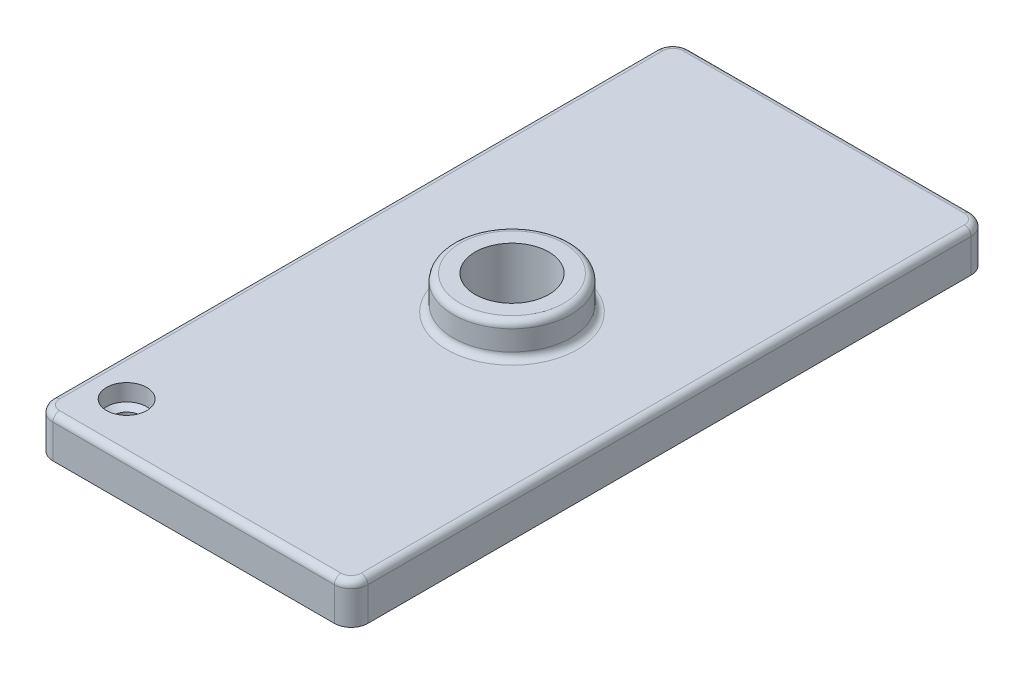
ISO-10303-21;
HEADER;
FILE_DESCRIPTION(('STEP AP214'),'2;1');
FILE_NAME('part.step','',(''),(''),'','','');
FILE_SCHEMA(('AUTOMOTIVE_DESIGN { 1 0 10303 214 1 1 1 1 }'));
ENDSEC;
DATA;
#1=APPLICATION_CONTEXT('core data for automotive mechanical design processes');
#2=APPLICATION_PROTOCOL_DEFINITION('international standard','automotive_design',2000,#1);
#3=PRODUCT_CONTEXT('',#1,'mechanical');
#4=PRODUCT('Part','Part','',(#3));
#5=PRODUCT_RELATED_PRODUCT_CATEGORY('part','',(#4));
#6=PRODUCT_DEFINITION_FORMATION('','',#4);
#7=PRODUCT_DEFINITION_CONTEXT('part definition',#1,'design');
#8=PRODUCT_DEFINITION('design','',#6,#7);
#9=PRODUCT_DEFINITION_SHAPE('','',#8);
#10=(LENGTH_UNIT() NAMED_UNIT(*) SI_UNIT(.MILLI.,.METRE.));
#11=(NAMED_UNIT(*) PLANE_ANGLE_UNIT() SI_UNIT($,.RADIAN.));
#12=(NAMED_UNIT(*) SI_UNIT($,.STERADIAN.) SOLID_ANGLE_UNIT());
#13=UNCERTAINTY_MEASURE_WITH_UNIT(LENGTH_MEASURE(1.E-05),#10,'distance_accuracy_value','');
#14=(GEOMETRIC_REPRESENTATION_CONTEXT(3) GLOBAL_UNCERTAINTY_ASSIGNED_CONTEXT((#13)) GLOBAL_UNIT_ASSIGNED_CONTEXT((#10,
#11,#12)) REPRESENTATION_CONTEXT('',''));
#15=CARTESIAN_POINT('',(0.,0.,0.));
#16=DIRECTION('',(0.,0.,1.));
#17=DIRECTION('',(1.,0.,0.));
#18=AXIS2_PLACEMENT_3D('',#15,#16,#17);
#19=CARTESIAN_POINT('',(-47.,12.,-95.));
#20=DIRECTION('',(0.,-1.,0.));
#21=DIRECTION('',(0.,0.,-1.));
#22=AXIS2_PLACEMENT_3D('',#19,#20,#21);
#23=PLANE('',#22);
#24=CARTESIAN_POINT('',(42.,12.,90.));
#25=DIRECTION('',(0.,-1.,0.));
#26=DIRECTION('',(0.,0.,-1.));
#27=AXIS2_PLACEMENT_3D('',#24,#25,#26);
#28=CIRCLE('',#27,3.);
#29=CARTESIAN_POINT('',(42.,12.,93.));
#30=VERTEX_POINT('',#29);
#31=CARTESIAN_POINT('',(45.,12.,90.));
#32=VERTEX_POINT('',#31);
#33=EDGE_CURVE('E193',#30,#32,#28,.F.);
#34=ORIENTED_EDGE('',*,*,#33,.T.);
#35=DIRECTION('',(0.,0.,-1.));
#36=VECTOR('',#35,1.);
#37=CARTESIAN_POINT('',(45.,12.,-95.));
#38=LINE('',#37,#36);
#39=CARTESIAN_POINT('',(45.,12.,-90.));
#40=VERTEX_POINT('',#39);
#41=EDGE_CURVE('E197',#32,#40,#38,.T.);
#42=ORIENTED_EDGE('',*,*,#41,.T.);
#43=CARTESIAN_POINT('',(42.,12.,-90.));
#44=DIRECTION('',(0.,-1.,0.));
#45=DIRECTION('',(0.,0.,-1.));
#46=AXIS2_PLACEMENT_3D('',#43,#44,#45);
#47=CIRCLE('',#46,3.);
#48=CARTESIAN_POINT('',(42.,12.,-93.));
#49=VERTEX_POINT('',#48);
#50=EDGE_CURVE('E195',#40,#49,#47,.F.);
#51=ORIENTED_EDGE('',*,*,#50,.T.);
#52=DIRECTION('',(-1.,0.,0.));
#53=VECTOR('',#52,1.);
#54=CARTESIAN_POINT('',(-47.,12.,-93.));
#55=LINE('',#54,#53);
#56=CARTESIAN_POINT('',(-42.,12.,-93.));
#57=VERTEX_POINT('',#56);
#58=EDGE_CURVE('E191',#49,#57,#55,.T.);
#59=ORIENTED_EDGE('',*,*,#58,.T.);
#60=CARTESIAN_POINT('',(-42.,12.,-90.));
#61=DIRECTION('',(0.,-1.,0.));
#62=DIRECTION('',(0.,0.,-1.));
#63=AXIS2_PLACEMENT_3D('',#60,#61,#62);
#64=CIRCLE('',#63,3.);
#65=CARTESIAN_POINT('',(-45.,12.,-90.));
#66=VERTEX_POINT('',#65);
#67=EDGE_CURVE('E187',#57,#66,#64,.F.);
#68=ORIENTED_EDGE('',*,*,#67,.T.);
#69=DIRECTION('',(0.,0.,1.));
#70=VECTOR('',#69,1.);
#71=CARTESIAN_POINT('',(-45.,12.,-95.));
#72=LINE('',#71,#70);
#73=CARTESIAN_POINT('',(-45.,12.,90.));
#74=VERTEX_POINT('',#73);
#75=EDGE_CURVE('E183',#66,#74,#72,.T.);
#76=ORIENTED_EDGE('',*,*,#75,.T.);
#77=CARTESIAN_POINT('',(-42.,12.,90.));
#78=DIRECTION('',(0.,-1.,0.));
#79=DIRECTION('',(0.,0.,-1.));
#80=AXIS2_PLACEMENT_3D('',#77,#78,#79);
#81=CIRCLE('',#80,3.);
#82=CARTESIAN_POINT('',(-42.,12.,93.));
#83=VERTEX_POINT('',#82);
#84=EDGE_CURVE('E185',#74,#83,#81,.F.);
#85=ORIENTED_EDGE('',*,*,#84,.T.);
#86=DIRECTION('',(1.,0.,0.));
#87=VECTOR('',#86,1.);
#88=CARTESIAN_POINT('',(-47.,12.,93.));
#89=LINE('',#88,#87);
#90=EDGE_CURVE('E189',#83,#30,#89,.T.);
#91=ORIENTED_EDGE('',*,*,#90,.T.);
#92=EDGE_LOOP('',(#34,#42,#51,#59,#68,#76,#85,#91));
#93=FACE_BOUND('',#92,.T.);
#94=CARTESIAN_POINT('',(0.,12.,0.));
#95=DIRECTION('',(0.,-1.,0.));
#96=DIRECTION('',(0.,0.,-1.));
#97=AXIS2_PLACEMENT_3D('',#94,#95,#96);
#98=CIRCLE('',#97,19.5);
#99=CARTESIAN_POINT('',(0.,12.,-19.5));
#100=VERTEX_POINT('',#99);
#101=EDGE_CURVE('E180',#100,#100,#98,.T.);
#102=ORIENTED_EDGE('',*,*,#101,.T.);
#103=EDGE_LOOP('',(#102));
#104=FACE_BOUND('',#103,.T.);
#105=CARTESIAN_POINT('',(-35.,12.,80.));
#106=DIRECTION('',(0.,1.,0.));
#107=DIRECTION('',(0.,0.,1.));
#108=AXIS2_PLACEMENT_3D('',#105,#106,#107);
#109=CIRCLE('',#108,6.);
#110=CARTESIAN_POINT('',(-35.,12.,86.));
#111=VERTEX_POINT('',#110);
#112=EDGE_CURVE('E255',#111,#111,#109,.T.);
#113=ORIENTED_EDGE('',*,*,#112,.F.);
#114=EDGE_LOOP('',(#113));
#115=FACE_BOUND('',#114,.T.);
#116=ADVANCED_FACE('F34',(#93,#104,#115),#23,.F.);
#117=CARTESIAN_POINT('',(-47.,12.,95.));
#118=DIRECTION('',(1.,0.,0.));
#119=DIRECTION('',(0.,0.,-1.));
#120=AXIS2_PLACEMENT_3D('',#117,#118,#119);
#121=PLANE('',#120);
#122=DIRECTION('',(0.,-1.,0.));
#123=VECTOR('',#122,1.);
#124=CARTESIAN_POINT('',(-47.,12.,90.));
#125=LINE('',#124,#123);
#126=CARTESIAN_POINT('',(-47.,0.,90.));
#127=VERTEX_POINT('',#126);
#128=CARTESIAN_POINT('',(-47.,10.,90.));
#129=VERTEX_POINT('',#128);
#130=EDGE_CURVE('E173',#127,#129,#125,.F.);
#131=ORIENTED_EDGE('',*,*,#130,.T.);
#132=DIRECTION('',(0.,0.,1.));
#133=VECTOR('',#132,1.);
#134=CARTESIAN_POINT('',(-47.,10.,95.));
#135=LINE('',#134,#133);
#136=CARTESIAN_POINT('',(-47.,10.,-90.));
#137=VERTEX_POINT('',#136);
#138=EDGE_CURVE('E58',#129,#137,#135,.F.);
#139=ORIENTED_EDGE('',*,*,#138,.T.);
#140=DIRECTION('',(0.,-1.,0.));
#141=VECTOR('',#140,1.);
#142=CARTESIAN_POINT('',(-47.,12.,-90.));
#143=LINE('',#142,#141);
#144=CARTESIAN_POINT('',(-47.,0.,-90.));
#145=VERTEX_POINT('',#144);
#146=EDGE_CURVE('E171',#137,#145,#143,.T.);
#147=ORIENTED_EDGE('',*,*,#146,.T.);
#148=DIRECTION('',(0.,0.,1.));
#149=VECTOR('',#148,1.);
#150=CARTESIAN_POINT('',(-47.,0.,95.));
#151=LINE('',#150,#149);
#152=EDGE_CURVE('E160',#145,#127,#151,.T.);
#153=ORIENTED_EDGE('',*,*,#152,.T.);
#154=EDGE_LOOP('',(#131,#139,#147,#153));
#155=FACE_BOUND('',#154,.T.);
#156=ADVANCED_FACE('F265',(#155),#121,.F.);
#157=CARTESIAN_POINT('',(-47.,12.,95.));
#158=DIRECTION('',(0.,0.,-1.));
#159=DIRECTION('',(-1.,0.,0.));
#160=AXIS2_PLACEMENT_3D('',#157,#158,#159);
#161=PLANE('',#160);
#162=DIRECTION('',(0.,-1.,0.));
#163=VECTOR('',#162,1.);
#164=CARTESIAN_POINT('',(42.,12.,95.));
#165=LINE('',#164,#163);
#166=CARTESIAN_POINT('',(42.,0.,95.));
#167=VERTEX_POINT('',#166);
#168=CARTESIAN_POINT('',(42.,10.,95.));
#169=VERTEX_POINT('',#168);
#170=EDGE_CURVE('E145',#167,#169,#165,.F.);
#171=ORIENTED_EDGE('',*,*,#170,.T.);
#172=DIRECTION('',(1.,0.,0.));
#173=VECTOR('',#172,1.);
#174=CARTESIAN_POINT('',(-47.,10.,95.));
#175=LINE('',#174,#173);
#176=CARTESIAN_POINT('',(-42.,10.,95.));
#177=VERTEX_POINT('',#176);
#178=EDGE_CURVE('E207',#169,#177,#175,.F.);
#179=ORIENTED_EDGE('',*,*,#178,.T.);
#180=DIRECTION('',(0.,-1.,0.));
#181=VECTOR('',#180,1.);
#182=CARTESIAN_POINT('',(-42.,12.,95.));
#183=LINE('',#182,#181);
#184=CARTESIAN_POINT('',(-42.,0.,95.));
#185=VERTEX_POINT('',#184);
#186=EDGE_CURVE('E149',#177,#185,#183,.T.);
#187=ORIENTED_EDGE('',*,*,#186,.T.);
#188=DIRECTION('',(1.,0.,0.));
#189=VECTOR('',#188,1.);
#190=CARTESIAN_POINT('',(-47.,0.,95.));
#191=LINE('',#190,#189);
#192=EDGE_CURVE('E156',#185,#167,#191,.T.);
#193=ORIENTED_EDGE('',*,*,#192,.T.);
#194=EDGE_LOOP('',(#171,#179,#187,#193));
#195=FACE_BOUND('',#194,.T.);
#196=ADVANCED_FACE('F270',(#195),#161,.F.);
#197=CARTESIAN_POINT('',(47.,12.,95.));
#198=DIRECTION('',(-1.,0.,0.));
#199=DIRECTION('',(0.,0.,1.));
#200=AXIS2_PLACEMENT_3D('',#197,#198,#199);
#201=PLANE('',#200);
#202=DIRECTION('',(0.,-1.,0.));
#203=VECTOR('',#202,1.);
#204=CARTESIAN_POINT('',(47.,12.,-90.));
#205=LINE('',#204,#203);
#206=CARTESIAN_POINT('',(47.,0.,-90.));
#207=VERTEX_POINT('',#206);
#208=CARTESIAN_POINT('',(47.,10.,-90.));
#209=VERTEX_POINT('',#208);
#210=EDGE_CURVE('E139',#207,#209,#205,.F.);
#211=ORIENTED_EDGE('',*,*,#210,.T.);
#212=DIRECTION('',(0.,0.,-1.));
#213=VECTOR('',#212,1.);
#214=CARTESIAN_POINT('',(47.,10.,95.));
#215=LINE('',#214,#213);
#216=CARTESIAN_POINT('',(47.,10.,90.));
#217=VERTEX_POINT('',#216);
#218=EDGE_CURVE('E136',#209,#217,#215,.F.);
#219=ORIENTED_EDGE('',*,*,#218,.T.);
#220=DIRECTION('',(0.,-1.,0.));
#221=VECTOR('',#220,1.);
#222=CARTESIAN_POINT('',(47.,12.,90.));
#223=LINE('',#222,#221);
#224=CARTESIAN_POINT('',(47.,0.,90.));
#225=VERTEX_POINT('',#224);
#226=EDGE_CURVE('E128',#217,#225,#223,.T.);
#227=ORIENTED_EDGE('',*,*,#226,.T.);
#228=DIRECTION('',(0.,0.,-1.));
#229=VECTOR('',#228,1.);
#230=CARTESIAN_POINT('',(47.,0.,95.));
#231=LINE('',#230,#229);
#232=EDGE_CURVE('E133',#225,#207,#231,.T.);
#233=ORIENTED_EDGE('',*,*,#232,.T.);
#234=EDGE_LOOP('',(#211,#219,#227,#233));
#235=FACE_BOUND('',#234,.T.);
#236=ADVANCED_FACE('F131',(#235),#201,.F.);
#237=CARTESIAN_POINT('',(-47.,12.,-95.));
#238=DIRECTION('',(0.,0.,1.));
#239=DIRECTION('',(1.,0.,0.));
#240=AXIS2_PLACEMENT_3D('',#237,#238,#239);
#241=PLANE('',#240);
#242=DIRECTION('',(0.,-1.,0.));
#243=VECTOR('',#242,1.);
#244=CARTESIAN_POINT('',(-42.,12.,-95.));
#245=LINE('',#244,#243);
#246=CARTESIAN_POINT('',(-42.,0.,-95.));
#247=VERTEX_POINT('',#246);
#248=CARTESIAN_POINT('',(-42.,10.,-95.));
#249=VERTEX_POINT('',#248);
#250=EDGE_CURVE('E177',#247,#249,#245,.F.);
#251=ORIENTED_EDGE('',*,*,#250,.T.);
#252=DIRECTION('',(-1.,0.,0.));
#253=VECTOR('',#252,1.);
#254=CARTESIAN_POINT('',(-47.,10.,-95.));
#255=LINE('',#254,#253);
#256=CARTESIAN_POINT('',(42.,10.,-95.));
#257=VERTEX_POINT('',#256);
#258=EDGE_CURVE('E205',#249,#257,#255,.F.);
#259=ORIENTED_EDGE('',*,*,#258,.T.);
#260=DIRECTION('',(0.,-1.,0.));
#261=VECTOR('',#260,1.);
#262=CARTESIAN_POINT('',(42.,12.,-95.));
#263=LINE('',#262,#261);
#264=CARTESIAN_POINT('',(42.,0.,-95.));
#265=VERTEX_POINT('',#264);
#266=EDGE_CURVE('E175',#257,#265,#263,.T.);
#267=ORIENTED_EDGE('',*,*,#266,.T.);
#268=DIRECTION('',(-1.,0.,0.));
#269=VECTOR('',#268,1.);
#270=CARTESIAN_POINT('',(-47.,0.,-95.));
#271=LINE('',#270,#269);
#272=EDGE_CURVE('E155',#265,#247,#271,.T.);
#273=ORIENTED_EDGE('',*,*,#272,.T.);
#274=EDGE_LOOP('',(#251,#259,#267,#273));
#275=FACE_BOUND('',#274,.T.);
#276=ADVANCED_FACE('F311',(#275),#241,.F.);
#277=CARTESIAN_POINT('',(-47.,0.,-95.));
#278=DIRECTION('',(0.,-1.,0.));
#279=DIRECTION('',(0.,0.,-1.));
#280=AXIS2_PLACEMENT_3D('',#277,#278,#279);
#281=PLANE('',#280);
#282=CARTESIAN_POINT('',(-35.,0.,80.));
#283=DIRECTION('',(0.,1.,0.));
#284=DIRECTION('',(0.,0.,1.));
#285=AXIS2_PLACEMENT_3D('',#282,#283,#284);
#286=CIRCLE('',#285,4.);
#287=CARTESIAN_POINT('',(-35.,0.,84.));
#288=VERTEX_POINT('',#287);
#289=EDGE_CURVE('E240',#288,#288,#286,.T.);
#290=ORIENTED_EDGE('',*,*,#289,.T.);
#291=EDGE_LOOP('',(#290));
#292=FACE_BOUND('',#291,.T.);
#293=CARTESIAN_POINT('',(0.,0.,0.));
#294=DIRECTION('',(0.,1.,0.));
#295=DIRECTION('',(0.,0.,1.));
#296=AXIS2_PLACEMENT_3D('',#293,#294,#295);
#297=CIRCLE('',#296,11.);
#298=CARTESIAN_POINT('',(0.,0.,11.));
#299=VERTEX_POINT('',#298);
#300=EDGE_CURVE('E259',#299,#299,#297,.T.);
#301=ORIENTED_EDGE('',*,*,#300,.T.);
#302=EDGE_LOOP('',(#301));
#303=FACE_BOUND('',#302,.T.);
#304=ORIENTED_EDGE('',*,*,#232,.F.);
#305=CARTESIAN_POINT('',(42.,0.,90.));
#306=DIRECTION('',(0.,-1.,0.));
#307=DIRECTION('',(0.,0.,-1.));
#308=AXIS2_PLACEMENT_3D('',#305,#306,#307);
#309=CIRCLE('',#308,5.);
#310=EDGE_CURVE('E142',#225,#167,#309,.T.);
#311=ORIENTED_EDGE('',*,*,#310,.T.);
#312=ORIENTED_EDGE('',*,*,#192,.F.);
#313=CARTESIAN_POINT('',(-42.,0.,90.));
#314=DIRECTION('',(0.,-1.,0.));
#315=DIRECTION('',(0.,0.,-1.));
#316=AXIS2_PLACEMENT_3D('',#313,#314,#315);
#317=CIRCLE('',#316,5.);
#318=EDGE_CURVE('E150',#185,#127,#317,.T.);
#319=ORIENTED_EDGE('',*,*,#318,.T.);
#320=ORIENTED_EDGE('',*,*,#152,.F.);
#321=CARTESIAN_POINT('',(-42.,0.,-90.));
#322=DIRECTION('',(0.,-1.,0.));
#323=DIRECTION('',(0.,0.,-1.));
#324=AXIS2_PLACEMENT_3D('',#321,#322,#323);
#325=CIRCLE('',#324,5.);
#326=EDGE_CURVE('E166',#145,#247,#325,.T.);
#327=ORIENTED_EDGE('',*,*,#326,.T.);
#328=ORIENTED_EDGE('',*,*,#272,.F.);
#329=CARTESIAN_POINT('',(42.,0.,-90.));
#330=DIRECTION('',(0.,-1.,0.));
#331=DIRECTION('',(0.,0.,-1.));
#332=AXIS2_PLACEMENT_3D('',#329,#330,#331);
#333=CIRCLE('',#332,5.);
#334=EDGE_CURVE('E138',#265,#207,#333,.T.);
#335=ORIENTED_EDGE('',*,*,#334,.T.);
#336=EDGE_LOOP('',(#304,#311,#312,#319,#320,#327,#328,#335));
#337=FACE_BOUND('',#336,.T.);
#338=ADVANCED_FACE('F152',(#292,#303,#337),#281,.T.);
#339=CARTESIAN_POINT('',(0.,22.,0.));
#340=DIRECTION('',(0.,-1.,0.));
#341=DIRECTION('',(0.,0.,-1.));
#342=AXIS2_PLACEMENT_3D('',#339,#340,#341);
#343=CYLINDRICAL_SURFACE('',#342,17.5);
#344=CARTESIAN_POINT('',(0.,14.,0.));
#345=DIRECTION('',(0.,-1.,0.));
#346=DIRECTION('',(0.,0.,-1.));
#347=AXIS2_PLACEMENT_3D('',#344,#345,#346);
#348=CIRCLE('',#347,17.5);
#349=CARTESIAN_POINT('',(0.,14.,-17.5));
#350=VERTEX_POINT('',#349);
#351=EDGE_CURVE('E43',#350,#350,#348,.F.);
#352=ORIENTED_EDGE('',*,*,#351,.T.);
#353=EDGE_LOOP('',(#352));
#354=FACE_BOUND('',#353,.T.);
#355=CARTESIAN_POINT('',(0.,20.,0.));
#356=DIRECTION('',(0.,1.,0.));
#357=DIRECTION('',(0.,0.,1.));
#358=AXIS2_PLACEMENT_3D('',#355,#356,#357);
#359=CIRCLE('',#358,17.5);
#360=CARTESIAN_POINT('',(0.,20.,17.5));
#361=VERTEX_POINT('',#360);
#362=EDGE_CURVE('E213',#361,#361,#359,.F.);
#363=ORIENTED_EDGE('',*,*,#362,.T.);
#364=EDGE_LOOP('',(#363));
#365=FACE_BOUND('',#364,.T.);
#366=ADVANCED_FACE('F307',(#354,#365),#343,.T.);
#367=CARTESIAN_POINT('',(0.,22.,0.));
#368=DIRECTION('',(0.,1.,0.));
#369=DIRECTION('',(0.,0.,1.));
#370=AXIS2_PLACEMENT_3D('',#367,#368,#369);
#371=PLANE('',#370);
#372=CARTESIAN_POINT('',(0.,22.,0.));
#373=DIRECTION('',(0.,1.,0.));
#374=DIRECTION('',(0.,0.,1.));
#375=AXIS2_PLACEMENT_3D('',#372,#373,#374);
#376=CIRCLE('',#375,15.5);
#377=CARTESIAN_POINT('',(0.,22.,15.5));
#378=VERTEX_POINT('',#377);
#379=EDGE_CURVE('E11',#378,#378,#376,.T.);
#380=ORIENTED_EDGE('',*,*,#379,.T.);
#381=EDGE_LOOP('',(#380));
#382=FACE_BOUND('',#381,.T.);
#383=CARTESIAN_POINT('',(0.,22.,0.));
#384=DIRECTION('',(0.,1.,0.));
#385=DIRECTION('',(0.,0.,1.));
#386=AXIS2_PLACEMENT_3D('',#383,#384,#385);
#387=CIRCLE('',#386,11.);
#388=CARTESIAN_POINT('',(0.,22.,11.));
#389=VERTEX_POINT('',#388);
#390=EDGE_CURVE('E258',#389,#389,#387,.T.);
#391=ORIENTED_EDGE('',*,*,#390,.F.);
#392=EDGE_LOOP('',(#391));
#393=FACE_BOUND('',#392,.T.);
#394=ADVANCED_FACE('F471',(#382,#393),#371,.T.);
#395=CARTESIAN_POINT('',(0.,0.,0.));
#396=DIRECTION('',(0.,1.,0.));
#397=DIRECTION('',(0.,0.,1.));
#398=AXIS2_PLACEMENT_3D('',#395,#396,#397);
#399=CYLINDRICAL_SURFACE('',#398,11.);
#400=ORIENTED_EDGE('',*,*,#300,.F.);
#401=EDGE_LOOP('',(#400));
#402=FACE_BOUND('',#401,.T.);
#403=ORIENTED_EDGE('',*,*,#390,.T.);
#404=EDGE_LOOP('',(#403));
#405=FACE_BOUND('',#404,.T.);
#406=ADVANCED_FACE('F462',(#402,#405),#399,.F.);
#407=CARTESIAN_POINT('',(-35.,12.,80.));
#408=DIRECTION('',(0.,1.,0.));
#409=DIRECTION('',(0.,0.,1.));
#410=AXIS2_PLACEMENT_3D('',#407,#408,#409);
#411=CYLINDRICAL_SURFACE('',#410,6.);
#412=CARTESIAN_POINT('',(-35.,7.,80.));
#413=DIRECTION('',(0.,1.,0.));
#414=DIRECTION('',(0.,0.,1.));
#415=AXIS2_PLACEMENT_3D('',#412,#413,#414);
#416=CIRCLE('',#415,6.);
#417=CARTESIAN_POINT('',(-35.,7.,86.));
#418=VERTEX_POINT('',#417);
#419=EDGE_CURVE('E250',#418,#418,#416,.T.);
#420=ORIENTED_EDGE('',*,*,#419,.F.);
#421=EDGE_LOOP('',(#420));
#422=FACE_BOUND('',#421,.T.);
#423=ORIENTED_EDGE('',*,*,#112,.T.);
#424=EDGE_LOOP('',(#423));
#425=FACE_BOUND('',#424,.T.);
#426=ADVANCED_FACE('F453',(#422,#425),#411,.F.);
#427=CARTESIAN_POINT('',(-35.,7.,80.));
#428=DIRECTION('',(0.,1.,0.));
#429=DIRECTION('',(0.,0.,1.));
#430=AXIS2_PLACEMENT_3D('',#427,#428,#429);
#431=CONICAL_SURFACE('',#430,6.,1.02974425867666);
#432=CARTESIAN_POINT('',(-35.,5.7982787619449,80.));
#433=DIRECTION('',(0.,1.,0.));
#434=DIRECTION('',(0.,0.,1.));
#435=AXIS2_PLACEMENT_3D('',#432,#433,#434);
#436=CIRCLE('',#435,4.00000000000001);
#437=CARTESIAN_POINT('',(-35.,5.7982787619449,84.));
#438=VERTEX_POINT('',#437);
#439=EDGE_CURVE('E245',#438,#438,#436,.T.);
#440=ORIENTED_EDGE('',*,*,#439,.F.);
#441=EDGE_LOOP('',(#440));
#442=FACE_BOUND('',#441,.T.);
#443=ORIENTED_EDGE('',*,*,#419,.T.);
#444=EDGE_LOOP('',(#443));
#445=FACE_BOUND('',#444,.T.);
#446=ADVANCED_FACE('F443',(#442,#445),#431,.F.);
#447=CARTESIAN_POINT('',(-35.,12.,80.));
#448=DIRECTION('',(0.,1.,0.));
#449=DIRECTION('',(0.,0.,1.));
#450=AXIS2_PLACEMENT_3D('',#447,#448,#449);
#451=CYLINDRICAL_SURFACE('',#450,4.00000000000001);
#452=ORIENTED_EDGE('',*,*,#289,.F.);
#453=EDGE_LOOP('',(#452));
#454=FACE_BOUND('',#453,.T.);
#455=ORIENTED_EDGE('',*,*,#439,.T.);
#456=EDGE_LOOP('',(#455));
#457=FACE_BOUND('',#456,.T.);
#458=ADVANCED_FACE('F321',(#454,#457),#451,.F.);
#459=CARTESIAN_POINT('',(42.,12.,90.));
#460=DIRECTION('',(0.,-1.,0.));
#461=DIRECTION('',(0.,0.,-1.));
#462=AXIS2_PLACEMENT_3D('',#459,#460,#461);
#463=CYLINDRICAL_SURFACE('',#462,5.);
#464=ORIENTED_EDGE('',*,*,#226,.F.);
#465=CARTESIAN_POINT('',(42.,10.,90.));
#466=DIRECTION('',(0.,-1.,0.));
#467=DIRECTION('',(0.,0.,-1.));
#468=AXIS2_PLACEMENT_3D('',#465,#466,#467);
#469=CIRCLE('',#468,5.);
#470=EDGE_CURVE('E203',#217,#169,#469,.T.);
#471=ORIENTED_EDGE('',*,*,#470,.T.);
#472=ORIENTED_EDGE('',*,*,#170,.F.);
#473=ORIENTED_EDGE('',*,*,#310,.F.);
#474=EDGE_LOOP('',(#464,#471,#472,#473));
#475=FACE_BOUND('',#474,.T.);
#476=ADVANCED_FACE('F143',(#475),#463,.T.);
#477=CARTESIAN_POINT('',(-42.,12.,90.));
#478=DIRECTION('',(0.,-1.,0.));
#479=DIRECTION('',(0.,0.,-1.));
#480=AXIS2_PLACEMENT_3D('',#477,#478,#479);
#481=CYLINDRICAL_SURFACE('',#480,5.);
#482=ORIENTED_EDGE('',*,*,#186,.F.);
#483=CARTESIAN_POINT('',(-42.,10.,90.));
#484=DIRECTION('',(0.,-1.,0.));
#485=DIRECTION('',(0.,0.,-1.));
#486=AXIS2_PLACEMENT_3D('',#483,#484,#485);
#487=CIRCLE('',#486,5.);
#488=EDGE_CURVE('E51',#177,#129,#487,.T.);
#489=ORIENTED_EDGE('',*,*,#488,.T.);
#490=ORIENTED_EDGE('',*,*,#130,.F.);
#491=ORIENTED_EDGE('',*,*,#318,.F.);
#492=EDGE_LOOP('',(#482,#489,#490,#491));
#493=FACE_BOUND('',#492,.T.);
#494=ADVANCED_FACE('F268',(#493),#481,.T.);
#495=CARTESIAN_POINT('',(-42.,12.,-90.));
#496=DIRECTION('',(0.,-1.,0.));
#497=DIRECTION('',(0.,0.,-1.));
#498=AXIS2_PLACEMENT_3D('',#495,#496,#497);
#499=CYLINDRICAL_SURFACE('',#498,5.);
#500=ORIENTED_EDGE('',*,*,#146,.F.);
#501=CARTESIAN_POINT('',(-42.,10.,-90.));
#502=DIRECTION('',(0.,-1.,0.));
#503=DIRECTION('',(0.,0.,-1.));
#504=AXIS2_PLACEMENT_3D('',#501,#502,#503);
#505=CIRCLE('',#504,5.);
#506=EDGE_CURVE('E209',#137,#249,#505,.T.);
#507=ORIENTED_EDGE('',*,*,#506,.T.);
#508=ORIENTED_EDGE('',*,*,#250,.F.);
#509=ORIENTED_EDGE('',*,*,#326,.F.);
#510=EDGE_LOOP('',(#500,#507,#508,#509));
#511=FACE_BOUND('',#510,.T.);
#512=ADVANCED_FACE('F324',(#511),#499,.T.);
#513=CARTESIAN_POINT('',(42.,12.,-90.));
#514=DIRECTION('',(0.,-1.,0.));
#515=DIRECTION('',(0.,0.,-1.));
#516=AXIS2_PLACEMENT_3D('',#513,#514,#515);
#517=CYLINDRICAL_SURFACE('',#516,5.);
#518=ORIENTED_EDGE('',*,*,#266,.F.);
#519=CARTESIAN_POINT('',(42.,10.,-90.));
#520=DIRECTION('',(0.,-1.,0.));
#521=DIRECTION('',(0.,0.,-1.));
#522=AXIS2_PLACEMENT_3D('',#519,#520,#521);
#523=CIRCLE('',#522,5.);
#524=EDGE_CURVE('E201',#257,#209,#523,.T.);
#525=ORIENTED_EDGE('',*,*,#524,.T.);
#526=ORIENTED_EDGE('',*,*,#210,.F.);
#527=ORIENTED_EDGE('',*,*,#334,.F.);
#528=EDGE_LOOP('',(#518,#525,#526,#527));
#529=FACE_BOUND('',#528,.T.);
#530=ADVANCED_FACE('F296',(#529),#517,.T.);
#531=CARTESIAN_POINT('',(-45.,10.,-95.));
#532=DIRECTION('',(0.,0.,1.));
#533=DIRECTION('',(1.,0.,0.));
#534=AXIS2_PLACEMENT_3D('',#531,#532,#533);
#535=CYLINDRICAL_SURFACE('',#534,2.);
#536=CARTESIAN_POINT('',(-45.,10.,-90.));
#537=DIRECTION('',(0.,0.,-1.));
#538=DIRECTION('',(-1.,0.,0.));
#539=AXIS2_PLACEMENT_3D('',#536,#537,#538);
#540=CIRCLE('',#539,2.);
#541=EDGE_CURVE('E233',#137,#66,#540,.T.);
#542=ORIENTED_EDGE('',*,*,#541,.F.);
#543=ORIENTED_EDGE('',*,*,#138,.F.);
#544=CARTESIAN_POINT('',(-45.,10.,90.));
#545=DIRECTION('',(0.,0.,1.));
#546=DIRECTION('',(1.,0.,0.));
#547=AXIS2_PLACEMENT_3D('',#544,#545,#546);
#548=CIRCLE('',#547,2.);
#549=EDGE_CURVE('E38',#74,#129,#548,.T.);
#550=ORIENTED_EDGE('',*,*,#549,.F.);
#551=ORIENTED_EDGE('',*,*,#75,.F.);
#552=EDGE_LOOP('',(#542,#543,#550,#551));
#553=FACE_BOUND('',#552,.T.);
#554=ADVANCED_FACE('F289',(#553),#535,.T.);
#555=CARTESIAN_POINT('',(-42.,10.,90.));
#556=DIRECTION('',(0.,-1.,0.));
#557=DIRECTION('',(0.,0.,-1.));
#558=AXIS2_PLACEMENT_3D('',#555,#556,#557);
#559=TOROIDAL_SURFACE('',#558,3.,2.);
#560=ORIENTED_EDGE('',*,*,#549,.T.);
#561=ORIENTED_EDGE('',*,*,#488,.F.);
#562=CARTESIAN_POINT('',(-42.,10.,93.));
#563=DIRECTION('',(1.,0.,0.));
#564=DIRECTION('',(0.,0.,-1.));
#565=AXIS2_PLACEMENT_3D('',#562,#563,#564);
#566=CIRCLE('',#565,2.);
#567=EDGE_CURVE('E231',#83,#177,#566,.T.);
#568=ORIENTED_EDGE('',*,*,#567,.F.);
#569=ORIENTED_EDGE('',*,*,#84,.F.);
#570=EDGE_LOOP('',(#560,#561,#568,#569));
#571=FACE_BOUND('',#570,.T.);
#572=ADVANCED_FACE('F286',(#571),#559,.T.);
#573=CARTESIAN_POINT('',(-42.,10.,-90.));
#574=DIRECTION('',(0.,-1.,0.));
#575=DIRECTION('',(0.,0.,-1.));
#576=AXIS2_PLACEMENT_3D('',#573,#574,#575);
#577=TOROIDAL_SURFACE('',#576,3.,2.);
#578=ORIENTED_EDGE('',*,*,#541,.T.);
#579=ORIENTED_EDGE('',*,*,#67,.F.);
#580=CARTESIAN_POINT('',(-42.,10.,-93.));
#581=DIRECTION('',(1.,0.,0.));
#582=DIRECTION('',(0.,0.,-1.));
#583=AXIS2_PLACEMENT_3D('',#580,#581,#582);
#584=CIRCLE('',#583,2.);
#585=EDGE_CURVE('E228',#249,#57,#584,.T.);
#586=ORIENTED_EDGE('',*,*,#585,.F.);
#587=ORIENTED_EDGE('',*,*,#506,.F.);
#588=EDGE_LOOP('',(#578,#579,#586,#587));
#589=FACE_BOUND('',#588,.T.);
#590=ADVANCED_FACE('F288',(#589),#577,.T.);
#591=CARTESIAN_POINT('',(-47.,10.,93.));
#592=DIRECTION('',(1.,0.,0.));
#593=DIRECTION('',(0.,0.,-1.));
#594=AXIS2_PLACEMENT_3D('',#591,#592,#593);
#595=CYLINDRICAL_SURFACE('',#594,2.);
#596=ORIENTED_EDGE('',*,*,#567,.T.);
#597=ORIENTED_EDGE('',*,*,#178,.F.);
#598=CARTESIAN_POINT('',(42.,10.,93.));
#599=DIRECTION('',(1.,0.,0.));
#600=DIRECTION('',(0.,0.,-1.));
#601=AXIS2_PLACEMENT_3D('',#598,#599,#600);
#602=CIRCLE('',#601,2.);
#603=EDGE_CURVE('E225',#30,#169,#602,.T.);
#604=ORIENTED_EDGE('',*,*,#603,.F.);
#605=ORIENTED_EDGE('',*,*,#90,.F.);
#606=EDGE_LOOP('',(#596,#597,#604,#605));
#607=FACE_BOUND('',#606,.T.);
#608=ADVANCED_FACE('F274',(#607),#595,.T.);
#609=CARTESIAN_POINT('',(-47.,10.,-93.));
#610=DIRECTION('',(-1.,0.,0.));
#611=DIRECTION('',(0.,0.,1.));
#612=AXIS2_PLACEMENT_3D('',#609,#610,#611);
#613=CYLINDRICAL_SURFACE('',#612,2.);
#614=ORIENTED_EDGE('',*,*,#585,.T.);
#615=ORIENTED_EDGE('',*,*,#58,.F.);
#616=CARTESIAN_POINT('',(42.,10.,-93.));
#617=DIRECTION('',(1.,0.,0.));
#618=DIRECTION('',(0.,0.,-1.));
#619=AXIS2_PLACEMENT_3D('',#616,#617,#618);
#620=CIRCLE('',#619,2.);
#621=EDGE_CURVE('E222',#257,#49,#620,.T.);
#622=ORIENTED_EDGE('',*,*,#621,.F.);
#623=ORIENTED_EDGE('',*,*,#258,.F.);
#624=EDGE_LOOP('',(#614,#615,#622,#623));
#625=FACE_BOUND('',#624,.T.);
#626=ADVANCED_FACE('F342',(#625),#613,.T.);
#627=CARTESIAN_POINT('',(42.,10.,90.));
#628=DIRECTION('',(0.,-1.,0.));
#629=DIRECTION('',(0.,0.,-1.));
#630=AXIS2_PLACEMENT_3D('',#627,#628,#629);
#631=TOROIDAL_SURFACE('',#630,3.,2.);
#632=ORIENTED_EDGE('',*,*,#603,.T.);
#633=ORIENTED_EDGE('',*,*,#470,.F.);
#634=CARTESIAN_POINT('',(45.,10.,90.));
#635=DIRECTION('',(0.,0.,-1.));
#636=DIRECTION('',(-1.,0.,0.));
#637=AXIS2_PLACEMENT_3D('',#634,#635,#636);
#638=CIRCLE('',#637,2.);
#639=EDGE_CURVE('E220',#32,#217,#638,.T.);
#640=ORIENTED_EDGE('',*,*,#639,.F.);
#641=ORIENTED_EDGE('',*,*,#33,.F.);
#642=EDGE_LOOP('',(#632,#633,#640,#641));
#643=FACE_BOUND('',#642,.T.);
#644=ADVANCED_FACE('F280',(#643),#631,.T.);
#645=CARTESIAN_POINT('',(42.,10.,-90.));
#646=DIRECTION('',(0.,-1.,0.));
#647=DIRECTION('',(0.,0.,-1.));
#648=AXIS2_PLACEMENT_3D('',#645,#646,#647);
#649=TOROIDAL_SURFACE('',#648,3.,2.);
#650=ORIENTED_EDGE('',*,*,#621,.T.);
#651=ORIENTED_EDGE('',*,*,#50,.F.);
#652=CARTESIAN_POINT('',(45.,10.,-90.));
#653=DIRECTION('',(0.,0.,1.));
#654=DIRECTION('',(1.,0.,0.));
#655=AXIS2_PLACEMENT_3D('',#652,#653,#654);
#656=CIRCLE('',#655,2.);
#657=EDGE_CURVE('E218',#209,#40,#656,.T.);
#658=ORIENTED_EDGE('',*,*,#657,.F.);
#659=ORIENTED_EDGE('',*,*,#524,.F.);
#660=EDGE_LOOP('',(#650,#651,#658,#659));
#661=FACE_BOUND('',#660,.T.);
#662=ADVANCED_FACE('F335',(#661),#649,.T.);
#663=CARTESIAN_POINT('',(45.,10.,-95.));
#664=DIRECTION('',(0.,0.,-1.));
#665=DIRECTION('',(-1.,0.,0.));
#666=AXIS2_PLACEMENT_3D('',#663,#664,#665);
#667=CYLINDRICAL_SURFACE('',#666,2.);
#668=ORIENTED_EDGE('',*,*,#639,.T.);
#669=ORIENTED_EDGE('',*,*,#218,.F.);
#670=ORIENTED_EDGE('',*,*,#657,.T.);
#671=ORIENTED_EDGE('',*,*,#41,.F.);
#672=EDGE_LOOP('',(#668,#669,#670,#671));
#673=FACE_BOUND('',#672,.T.);
#674=ADVANCED_FACE('F331',(#673),#667,.T.);
#675=CARTESIAN_POINT('',(0.,14.,0.));
#676=DIRECTION('',(0.,-1.,0.));
#677=DIRECTION('',(0.,0.,-1.));
#678=AXIS2_PLACEMENT_3D('',#675,#676,#677);
#679=TOROIDAL_SURFACE('',#678,19.5,2.);
#680=ORIENTED_EDGE('',*,*,#101,.F.);
#681=EDGE_LOOP('',(#680));
#682=FACE_BOUND('',#681,.T.);
#683=ORIENTED_EDGE('',*,*,#351,.F.);
#684=EDGE_LOOP('',(#683));
#685=FACE_BOUND('',#684,.T.);
#686=ADVANCED_FACE('F334',(#682,#685),#679,.F.);
#687=CARTESIAN_POINT('',(0.,20.,0.));
#688=DIRECTION('',(0.,1.,0.));
#689=DIRECTION('',(0.,0.,1.));
#690=AXIS2_PLACEMENT_3D('',#687,#688,#689);
#691=TOROIDAL_SURFACE('',#690,15.5,2.);
#692=ORIENTED_EDGE('',*,*,#362,.F.);
#693=EDGE_LOOP('',(#692));
#694=FACE_BOUND('',#693,.T.);
#695=ORIENTED_EDGE('',*,*,#379,.F.);
#696=EDGE_LOOP('',(#695));
#697=FACE_BOUND('',#696,.T.);
#698=ADVANCED_FACE('F36',(#694,#697),#691,.T.);
#699=CLOSED_SHELL('',(#116,#156,#196,#236,#276,#338,#366,#394,#406,#426,#446,#458,#476,#494,
#512,#530,#554,#572,#590,#608,#626,#644,#662,#674,#686,#698));
#700=MANIFOLD_SOLID_BREP('B2',#699);
#701=ADVANCED_BREP_SHAPE_REPRESENTATION('',(#18,#700),#14);
#702=SHAPE_DEFINITION_REPRESENTATION(#9,#701);
ENDSEC;
END-ISO-10303-21;
